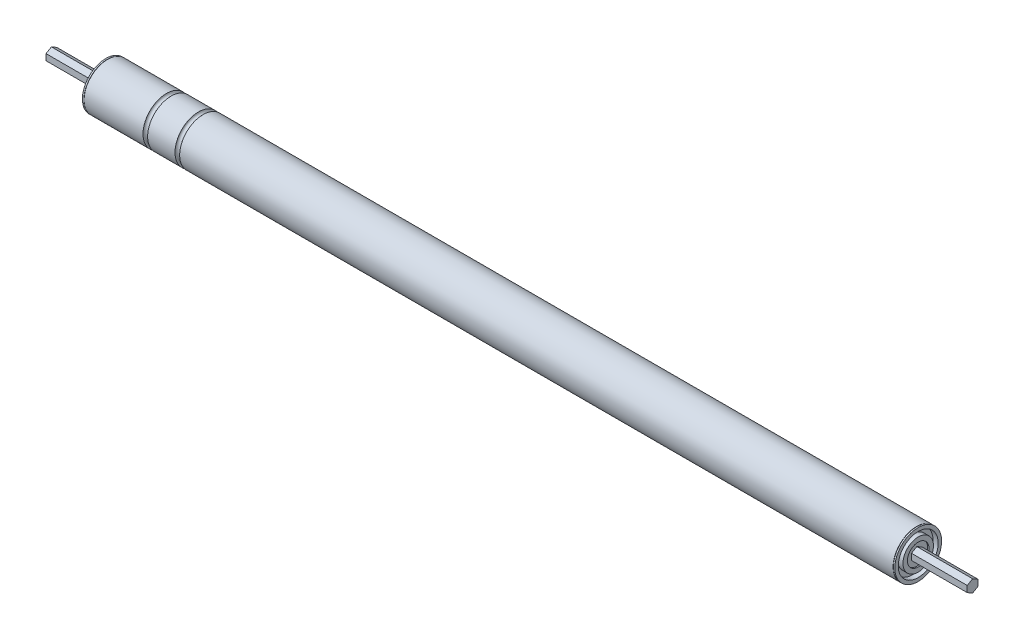
ISO-10303-21;
HEADER;
FILE_DESCRIPTION(('STEP AP214'),'2;1');
FILE_NAME('part.step','',(''),(''),'','','');
FILE_SCHEMA(('AUTOMOTIVE_DESIGN { 1 0 10303 214 1 1 1 1 }'));
ENDSEC;
DATA;
#1=APPLICATION_CONTEXT('core data for automotive mechanical design processes');
#2=APPLICATION_PROTOCOL_DEFINITION('international standard','automotive_design',2000,#1);
#3=PRODUCT_CONTEXT('',#1,'mechanical');
#4=PRODUCT('Part','Part','',(#3));
#5=PRODUCT_RELATED_PRODUCT_CATEGORY('part','',(#4));
#6=PRODUCT_DEFINITION_FORMATION('','',#4);
#7=PRODUCT_DEFINITION_CONTEXT('part definition',#1,'design');
#8=PRODUCT_DEFINITION('design','',#6,#7);
#9=PRODUCT_DEFINITION_SHAPE('','',#8);
#10=(LENGTH_UNIT() NAMED_UNIT(*) SI_UNIT(.MILLI.,.METRE.));
#11=(NAMED_UNIT(*) PLANE_ANGLE_UNIT() SI_UNIT($,.RADIAN.));
#12=(NAMED_UNIT(*) SI_UNIT($,.STERADIAN.) SOLID_ANGLE_UNIT());
#13=UNCERTAINTY_MEASURE_WITH_UNIT(LENGTH_MEASURE(1.E-05),#10,'distance_accuracy_value','');
#14=(GEOMETRIC_REPRESENTATION_CONTEXT(3) GLOBAL_UNCERTAINTY_ASSIGNED_CONTEXT((#13)) GLOBAL_UNIT_ASSIGNED_CONTEXT((#10,
#11,#12)) REPRESENTATION_CONTEXT('',''));
#15=CARTESIAN_POINT('',(0.,0.,0.));
#16=DIRECTION('',(0.,0.,1.));
#17=DIRECTION('',(1.,0.,0.));
#18=AXIS2_PLACEMENT_3D('',#15,#16,#17);
#19=CARTESIAN_POINT('',(480.034821520126,0.,0.));
#20=DIRECTION('',(-1.,0.,0.));
#21=DIRECTION('',(0.,0.,1.));
#22=AXIS2_PLACEMENT_3D('',#19,#20,#21);
#23=CYLINDRICAL_SURFACE('',#22,24.13);
#24=CARTESIAN_POINT('',(-351.630678291306,0.,0.));
#25=DIRECTION('',(1.,0.,0.));
#26=DIRECTION('',(0.,1.,0.));
#27=AXIS2_PLACEMENT_3D('',#24,#25,#26);
#28=CIRCLE('',#27,24.13);
#29=CARTESIAN_POINT('',(-351.630678291306,24.1300000000001,0.));
#30=VERTEX_POINT('',#29);
#31=EDGE_CURVE('E359',#30,#30,#28,.F.);
#32=ORIENTED_EDGE('',*,*,#31,.F.);
#33=EDGE_LOOP('',(#32));
#34=FACE_BOUND('',#33,.T.);
#35=CARTESIAN_POINT('',(-323.374321708694,0.,0.));
#36=DIRECTION('',(-1.,0.,0.));
#37=DIRECTION('',(0.,-1.,0.));
#38=AXIS2_PLACEMENT_3D('',#35,#36,#37);
#39=CIRCLE('',#38,24.13);
#40=CARTESIAN_POINT('',(-323.374321708694,-24.1299999999999,0.));
#41=VERTEX_POINT('',#40);
#42=EDGE_CURVE('E203',#41,#41,#39,.F.);
#43=ORIENTED_EDGE('',*,*,#42,.F.);
#44=EDGE_LOOP('',(#43));
#45=FACE_BOUND('',#44,.T.);
#46=ADVANCED_FACE('F39',(#34,#45),#23,.T.);
#47=CARTESIAN_POINT('',(-350.84385,0.,0.));
#48=DIRECTION('',(-1.,0.,0.));
#49=DIRECTION('',(0.,-1.,0.));
#50=AXIS2_PLACEMENT_3D('',#47,#48,#49);
#51=TOROIDAL_SURFACE('',#50,24.1000000000011,0.787399999999969);
#52=CARTESIAN_POINT('',(-351.63125,0.,0.));
#53=DIRECTION('',(-1.,0.,0.));
#54=DIRECTION('',(0.,-1.,0.));
#55=AXIS2_PLACEMENT_3D('',#52,#53,#54);
#56=CIRCLE('',#55,24.1000000000012);
#57=CARTESIAN_POINT('',(-351.63125,-24.1000000000011,0.));
#58=VERTEX_POINT('',#57);
#59=EDGE_CURVE('E208',#58,#58,#56,.T.);
#60=ORIENTED_EDGE('',*,*,#59,.F.);
#61=EDGE_LOOP('',(#60));
#62=FACE_BOUND('',#61,.T.);
#63=ORIENTED_EDGE('',*,*,#31,.T.);
#64=EDGE_LOOP('',(#63));
#65=FACE_BOUND('',#64,.T.);
#66=ADVANCED_FACE('F390',(#62,#65),#51,.T.);
#67=CARTESIAN_POINT('',(-357.18115,0.,0.));
#68=DIRECTION('',(-1.,0.,0.));
#69=DIRECTION('',(0.,-1.,0.));
#70=AXIS2_PLACEMENT_3D('',#67,#68,#69);
#71=TOROIDAL_SURFACE('',#70,24.1000000000012,0.787399999999969);
#72=CARTESIAN_POINT('',(-356.39375,0.,0.));
#73=DIRECTION('',(-1.,0.,0.));
#74=DIRECTION('',(0.,-1.,0.));
#75=AXIS2_PLACEMENT_3D('',#72,#73,#74);
#76=CIRCLE('',#75,24.1000000000012);
#77=CARTESIAN_POINT('',(-356.39375,-24.1000000000011,0.));
#78=VERTEX_POINT('',#77);
#79=EDGE_CURVE('E204',#78,#78,#76,.T.);
#80=ORIENTED_EDGE('',*,*,#79,.T.);
#81=EDGE_LOOP('',(#80));
#82=FACE_BOUND('',#81,.T.);
#83=CARTESIAN_POINT('',(-356.394321708694,0.,0.));
#84=DIRECTION('',(-1.,0.,0.));
#85=DIRECTION('',(0.,-1.,0.));
#86=AXIS2_PLACEMENT_3D('',#83,#84,#85);
#87=CIRCLE('',#86,24.13);
#88=CARTESIAN_POINT('',(-356.394321708694,-24.1299999999999,0.));
#89=VERTEX_POINT('',#88);
#90=EDGE_CURVE('E212',#89,#89,#87,.F.);
#91=ORIENTED_EDGE('',*,*,#90,.T.);
#92=EDGE_LOOP('',(#91));
#93=FACE_BOUND('',#92,.T.);
#94=ADVANCED_FACE('F409',(#82,#93),#71,.T.);
#95=CARTESIAN_POINT('',(-354.0125,0.,0.));
#96=DIRECTION('',(-1.,0.,0.));
#97=DIRECTION('',(0.,-1.,0.));
#98=AXIS2_PLACEMENT_3D('',#95,#96,#97);
#99=TOROIDAL_SURFACE('',#98,24.1000000000012,2.38125000000006);
#100=ORIENTED_EDGE('',*,*,#59,.T.);
#101=EDGE_LOOP('',(#100));
#102=FACE_BOUND('',#101,.T.);
#103=ORIENTED_EDGE('',*,*,#79,.F.);
#104=EDGE_LOOP('',(#103));
#105=FACE_BOUND('',#104,.T.);
#106=ADVANCED_FACE('F411',(#102,#105),#99,.F.);
#107=CARTESIAN_POINT('',(431.8,-3.20790243318486,-5.55625));
#108=DIRECTION('',(0.,0.,1.));
#109=DIRECTION('',(1.,0.,0.));
#110=AXIS2_PLACEMENT_3D('',#107,#108,#109);
#111=PLANE('',#110);
#112=DIRECTION('',(-1.,0.,0.));
#113=VECTOR('',#112,1.);
#114=CARTESIAN_POINT('',(431.8,3.20790243318486,-5.55625));
#115=LINE('',#114,#113);
#116=CARTESIAN_POINT('',(-417.5125,3.20790243318486,-5.55625));
#117=VERTEX_POINT('',#116);
#118=CARTESIAN_POINT('',(-475.,3.20790243318486,-5.55625));
#119=VERTEX_POINT('',#118);
#120=EDGE_CURVE('E154',#117,#119,#115,.T.);
#121=ORIENTED_EDGE('',*,*,#120,.F.);
#122=DIRECTION('',(0.,-1.,0.));
#123=VECTOR('',#122,1.);
#124=CARTESIAN_POINT('',(-417.5125,0.,-5.55625));
#125=LINE('',#124,#123);
#126=CARTESIAN_POINT('',(-417.5125,-3.20790243318486,-5.55625));
#127=VERTEX_POINT('',#126);
#128=EDGE_CURVE('E238',#117,#127,#125,.T.);
#129=ORIENTED_EDGE('',*,*,#128,.T.);
#130=DIRECTION('',(-1.,0.,0.));
#131=VECTOR('',#130,1.);
#132=CARTESIAN_POINT('',(431.8,-3.20790243318486,-5.55625));
#133=LINE('',#132,#131);
#134=CARTESIAN_POINT('',(-475.,-3.20790243318486,-5.55625));
#135=VERTEX_POINT('',#134);
#136=EDGE_CURVE('E217',#127,#135,#133,.T.);
#137=ORIENTED_EDGE('',*,*,#136,.T.);
#138=DIRECTION('',(0.,1.,0.));
#139=VECTOR('',#138,1.);
#140=CARTESIAN_POINT('',(-475.,-3.20790243318486,-5.55625));
#141=LINE('',#140,#139);
#142=EDGE_CURVE('E168',#135,#119,#141,.T.);
#143=ORIENTED_EDGE('',*,*,#142,.T.);
#144=EDGE_LOOP('',(#121,#129,#137,#143));
#145=FACE_BOUND('',#144,.T.);
#146=ADVANCED_FACE('F418',(#145),#111,.F.);
#147=CARTESIAN_POINT('',(431.8,-6.41580486636972,0.));
#148=DIRECTION('',(0.,0.866025403784439,0.5));
#149=DIRECTION('',(0.,-0.5,0.866025403784439));
#150=AXIS2_PLACEMENT_3D('',#147,#148,#149);
#151=PLANE('',#150);
#152=ORIENTED_EDGE('',*,*,#136,.F.);
#153=DIRECTION('',(0.,-0.5,0.866025403784439));
#154=VECTOR('',#153,1.);
#155=CARTESIAN_POINT('',(-417.5125,-4.81185364977729,-2.778125));
#156=LINE('',#155,#154);
#157=CARTESIAN_POINT('',(-417.5125,-6.41580486636971,0.));
#158=VERTEX_POINT('',#157);
#159=EDGE_CURVE('E242',#127,#158,#156,.T.);
#160=ORIENTED_EDGE('',*,*,#159,.T.);
#161=DIRECTION('',(-1.,0.,0.));
#162=VECTOR('',#161,1.);
#163=CARTESIAN_POINT('',(431.8,-6.41580486636972,0.));
#164=LINE('',#163,#162);
#165=CARTESIAN_POINT('',(-475.,-6.41580486636972,0.));
#166=VERTEX_POINT('',#165);
#167=EDGE_CURVE('E222',#158,#166,#164,.T.);
#168=ORIENTED_EDGE('',*,*,#167,.T.);
#169=DIRECTION('',(0.,0.5,-0.866025403784439));
#170=VECTOR('',#169,1.);
#171=CARTESIAN_POINT('',(-475.,-6.41580486636972,0.));
#172=LINE('',#171,#170);
#173=EDGE_CURVE('E164',#166,#135,#172,.T.);
#174=ORIENTED_EDGE('',*,*,#173,.T.);
#175=EDGE_LOOP('',(#152,#160,#168,#174));
#176=FACE_BOUND('',#175,.T.);
#177=ADVANCED_FACE('F427',(#176),#151,.F.);
#178=CARTESIAN_POINT('',(431.8,-3.20790243318486,5.55625));
#179=DIRECTION('',(0.,0.866025403784439,-0.5));
#180=DIRECTION('',(0.,0.5,0.866025403784439));
#181=AXIS2_PLACEMENT_3D('',#178,#179,#180);
#182=PLANE('',#181);
#183=ORIENTED_EDGE('',*,*,#167,.F.);
#184=DIRECTION('',(0.,0.5,0.866025403784439));
#185=VECTOR('',#184,1.);
#186=CARTESIAN_POINT('',(-417.5125,-4.81185364977729,2.778125));
#187=LINE('',#186,#185);
#188=CARTESIAN_POINT('',(-417.5125,-3.20790243318486,5.55625));
#189=VERTEX_POINT('',#188);
#190=EDGE_CURVE('E246',#158,#189,#187,.T.);
#191=ORIENTED_EDGE('',*,*,#190,.T.);
#192=DIRECTION('',(-1.,0.,0.));
#193=VECTOR('',#192,1.);
#194=CARTESIAN_POINT('',(431.8,-3.20790243318486,5.55625));
#195=LINE('',#194,#193);
#196=CARTESIAN_POINT('',(-475.,-3.20790243318486,5.55625));
#197=VERTEX_POINT('',#196);
#198=EDGE_CURVE('E227',#189,#197,#195,.T.);
#199=ORIENTED_EDGE('',*,*,#198,.T.);
#200=DIRECTION('',(0.,-0.5,-0.866025403784439));
#201=VECTOR('',#200,1.);
#202=CARTESIAN_POINT('',(-475.,-3.20790243318486,5.55625));
#203=LINE('',#202,#201);
#204=EDGE_CURVE('E160',#197,#166,#203,.T.);
#205=ORIENTED_EDGE('',*,*,#204,.T.);
#206=EDGE_LOOP('',(#183,#191,#199,#205));
#207=FACE_BOUND('',#206,.T.);
#208=ADVANCED_FACE('F432',(#207),#182,.F.);
#209=CARTESIAN_POINT('',(431.8,3.20790243318486,5.55625));
#210=DIRECTION('',(0.,0.,-1.));
#211=DIRECTION('',(-1.,0.,0.));
#212=AXIS2_PLACEMENT_3D('',#209,#210,#211);
#213=PLANE('',#212);
#214=ORIENTED_EDGE('',*,*,#198,.F.);
#215=DIRECTION('',(0.,1.,0.));
#216=VECTOR('',#215,1.);
#217=CARTESIAN_POINT('',(-417.5125,0.,5.55625));
#218=LINE('',#217,#216);
#219=CARTESIAN_POINT('',(-417.5125,3.20790243318486,5.55625));
#220=VERTEX_POINT('',#219);
#221=EDGE_CURVE('E250',#189,#220,#218,.T.);
#222=ORIENTED_EDGE('',*,*,#221,.T.);
#223=DIRECTION('',(-1.,0.,0.));
#224=VECTOR('',#223,1.);
#225=CARTESIAN_POINT('',(431.8,3.20790243318486,5.55625));
#226=LINE('',#225,#224);
#227=CARTESIAN_POINT('',(-475.,3.20790243318486,5.55625));
#228=VERTEX_POINT('',#227);
#229=EDGE_CURVE('E232',#220,#228,#226,.T.);
#230=ORIENTED_EDGE('',*,*,#229,.T.);
#231=DIRECTION('',(0.,-1.,0.));
#232=VECTOR('',#231,1.);
#233=CARTESIAN_POINT('',(-475.,3.20790243318486,5.55625));
#234=LINE('',#233,#232);
#235=EDGE_CURVE('E149',#228,#197,#234,.T.);
#236=ORIENTED_EDGE('',*,*,#235,.T.);
#237=EDGE_LOOP('',(#214,#222,#230,#236));
#238=FACE_BOUND('',#237,.T.);
#239=ADVANCED_FACE('F437',(#238),#213,.F.);
#240=CARTESIAN_POINT('',(431.8,6.41580486636972,0.));
#241=DIRECTION('',(0.,-0.866025403784439,-0.5));
#242=DIRECTION('',(0.,0.5,-0.866025403784439));
#243=AXIS2_PLACEMENT_3D('',#240,#241,#242);
#244=PLANE('',#243);
#245=ORIENTED_EDGE('',*,*,#229,.F.);
#246=DIRECTION('',(0.,0.5,-0.866025403784439));
#247=VECTOR('',#246,1.);
#248=CARTESIAN_POINT('',(-417.5125,4.81185364977729,2.778125));
#249=LINE('',#248,#247);
#250=CARTESIAN_POINT('',(-417.5125,6.41580486636972,0.));
#251=VERTEX_POINT('',#250);
#252=EDGE_CURVE('E61',#220,#251,#249,.T.);
#253=ORIENTED_EDGE('',*,*,#252,.T.);
#254=DIRECTION('',(-1.,0.,0.));
#255=VECTOR('',#254,1.);
#256=CARTESIAN_POINT('',(431.8,6.41580486636972,0.));
#257=LINE('',#256,#255);
#258=CARTESIAN_POINT('',(-475.,6.41580486636972,0.));
#259=VERTEX_POINT('',#258);
#260=EDGE_CURVE('E129',#251,#259,#257,.T.);
#261=ORIENTED_EDGE('',*,*,#260,.T.);
#262=DIRECTION('',(0.,-0.5,0.866025403784439));
#263=VECTOR('',#262,1.);
#264=CARTESIAN_POINT('',(-475.,6.41580486636972,0.));
#265=LINE('',#264,#263);
#266=EDGE_CURVE('E133',#259,#228,#265,.T.);
#267=ORIENTED_EDGE('',*,*,#266,.T.);
#268=EDGE_LOOP('',(#245,#253,#261,#267));
#269=FACE_BOUND('',#268,.T.);
#270=ADVANCED_FACE('F132',(#269),#244,.F.);
#271=CARTESIAN_POINT('',(431.8,3.20790243318486,-5.55625));
#272=DIRECTION('',(0.,-0.866025403784439,0.5));
#273=DIRECTION('',(0.,-0.5,-0.866025403784439));
#274=AXIS2_PLACEMENT_3D('',#271,#272,#273);
#275=PLANE('',#274);
#276=ORIENTED_EDGE('',*,*,#260,.F.);
#277=DIRECTION('',(0.,-0.5,-0.866025403784439));
#278=VECTOR('',#277,1.);
#279=CARTESIAN_POINT('',(-417.5125,4.81185364977729,-2.778125));
#280=LINE('',#279,#278);
#281=EDGE_CURVE('E57',#251,#117,#280,.T.);
#282=ORIENTED_EDGE('',*,*,#281,.T.);
#283=ORIENTED_EDGE('',*,*,#120,.T.);
#284=DIRECTION('',(0.,0.5,0.866025403784439));
#285=VECTOR('',#284,1.);
#286=CARTESIAN_POINT('',(-475.,3.20790243318486,-5.55625));
#287=LINE('',#286,#285);
#288=EDGE_CURVE('E145',#119,#259,#287,.T.);
#289=ORIENTED_EDGE('',*,*,#288,.T.);
#290=EDGE_LOOP('',(#276,#282,#283,#289));
#291=FACE_BOUND('',#290,.T.);
#292=ADVANCED_FACE('F152',(#291),#275,.F.);
#293=CARTESIAN_POINT('',(-417.5125,0.,0.));
#294=DIRECTION('',(1.,0.,0.));
#295=DIRECTION('',(0.,1.,0.));
#296=AXIS2_PLACEMENT_3D('',#293,#294,#295);
#297=PLANE('',#296);
#298=CARTESIAN_POINT('',(-417.5125,0.,0.));
#299=DIRECTION('',(-1.,0.,0.));
#300=DIRECTION('',(0.,-1.,0.));
#301=AXIS2_PLACEMENT_3D('',#298,#299,#300);
#302=CIRCLE('',#301,11.1125);
#303=CARTESIAN_POINT('',(-417.5125,-11.1125,0.));
#304=VERTEX_POINT('',#303);
#305=EDGE_CURVE('E317',#304,#304,#302,.T.);
#306=ORIENTED_EDGE('',*,*,#305,.T.);
#307=EDGE_LOOP('',(#306));
#308=FACE_BOUND('',#307,.T.);
#309=ORIENTED_EDGE('',*,*,#281,.F.);
#310=ORIENTED_EDGE('',*,*,#252,.F.);
#311=ORIENTED_EDGE('',*,*,#221,.F.);
#312=ORIENTED_EDGE('',*,*,#190,.F.);
#313=ORIENTED_EDGE('',*,*,#159,.F.);
#314=ORIENTED_EDGE('',*,*,#128,.F.);
#315=EDGE_LOOP('',(#309,#310,#311,#312,#313,#314));
#316=FACE_BOUND('',#315,.T.);
#317=ADVANCED_FACE('F448',(#308,#316),#297,.F.);
#318=CARTESIAN_POINT('',(-417.5125,0.,0.));
#319=DIRECTION('',(-1.,0.,0.));
#320=DIRECTION('',(0.,-1.,0.));
#321=AXIS2_PLACEMENT_3D('',#318,#319,#320);
#322=CYLINDRICAL_SURFACE('',#321,11.1125);
#323=ORIENTED_EDGE('',*,*,#305,.F.);
#324=EDGE_LOOP('',(#323));
#325=FACE_BOUND('',#324,.T.);
#326=CARTESIAN_POINT('',(-418.896875,0.,0.));
#327=DIRECTION('',(-1.,0.,0.));
#328=DIRECTION('',(0.,-1.,0.));
#329=AXIS2_PLACEMENT_3D('',#326,#327,#328);
#330=CIRCLE('',#329,11.1125);
#331=CARTESIAN_POINT('',(-418.896875,-11.1125,0.));
#332=VERTEX_POINT('',#331);
#333=EDGE_CURVE('E313',#332,#332,#330,.T.);
#334=ORIENTED_EDGE('',*,*,#333,.T.);
#335=EDGE_LOOP('',(#334));
#336=FACE_BOUND('',#335,.T.);
#337=ADVANCED_FACE('F573',(#325,#336),#322,.F.);
#338=CARTESIAN_POINT('',(-418.896875,-11.1125,0.));
#339=DIRECTION('',(1.,0.,0.));
#340=DIRECTION('',(0.,1.,0.));
#341=AXIS2_PLACEMENT_3D('',#338,#339,#340);
#342=PLANE('',#341);
#343=ORIENTED_EDGE('',*,*,#333,.F.);
#344=EDGE_LOOP('',(#343));
#345=FACE_BOUND('',#344,.T.);
#346=CARTESIAN_POINT('',(-418.896875,0.,0.));
#347=DIRECTION('',(-1.,0.,0.));
#348=DIRECTION('',(0.,-1.,0.));
#349=AXIS2_PLACEMENT_3D('',#346,#347,#348);
#350=CIRCLE('',#349,15.7129275651736);
#351=CARTESIAN_POINT('',(-418.896875,-15.7129275651736,0.));
#352=VERTEX_POINT('',#351);
#353=EDGE_CURVE('E309',#352,#352,#350,.T.);
#354=ORIENTED_EDGE('',*,*,#353,.T.);
#355=EDGE_LOOP('',(#354));
#356=FACE_BOUND('',#355,.T.);
#357=ADVANCED_FACE('F582',(#345,#356),#342,.F.);
#358=CARTESIAN_POINT('',(-417.5125,0.,0.));
#359=DIRECTION('',(-1.,0.,0.));
#360=DIRECTION('',(0.,-1.,0.));
#361=AXIS2_PLACEMENT_3D('',#358,#359,#360);
#362=CYLINDRICAL_SURFACE('',#361,15.7129275651736);
#363=ORIENTED_EDGE('',*,*,#353,.F.);
#364=EDGE_LOOP('',(#363));
#365=FACE_BOUND('',#364,.T.);
#366=CARTESIAN_POINT('',(-413.562875,0.,0.));
#367=DIRECTION('',(-1.,0.,0.));
#368=DIRECTION('',(0.,-1.,0.));
#369=AXIS2_PLACEMENT_3D('',#366,#367,#368);
#370=CIRCLE('',#369,15.7129275651736);
#371=CARTESIAN_POINT('',(-413.562875,-15.7129275651736,0.));
#372=VERTEX_POINT('',#371);
#373=EDGE_CURVE('E305',#372,#372,#370,.T.);
#374=ORIENTED_EDGE('',*,*,#373,.T.);
#375=EDGE_LOOP('',(#374));
#376=FACE_BOUND('',#375,.T.);
#377=ADVANCED_FACE('F590',(#365,#376),#362,.T.);
#378=CARTESIAN_POINT('',(-413.562875,-15.7129275651736,1.09722786744795E-13));
#379=DIRECTION('',(1.,0.,0.));
#380=DIRECTION('',(0.,1.,0.));
#381=AXIS2_PLACEMENT_3D('',#378,#379,#380);
#382=PLANE('',#381);
#383=ORIENTED_EDGE('',*,*,#373,.F.);
#384=EDGE_LOOP('',(#383));
#385=FACE_BOUND('',#384,.T.);
#386=CARTESIAN_POINT('',(-413.562875,0.,0.));
#387=DIRECTION('',(-1.,0.,0.));
#388=DIRECTION('',(0.,-1.,0.));
#389=AXIS2_PLACEMENT_3D('',#386,#387,#388);
#390=CIRCLE('',#389,20.574);
#391=CARTESIAN_POINT('',(-413.562875,-20.574,0.));
#392=VERTEX_POINT('',#391);
#393=EDGE_CURVE('E301',#392,#392,#390,.T.);
#394=ORIENTED_EDGE('',*,*,#393,.T.);
#395=EDGE_LOOP('',(#394));
#396=FACE_BOUND('',#395,.T.);
#397=ADVANCED_FACE('F598',(#385,#396),#382,.F.);
#398=CARTESIAN_POINT('',(-417.5125,0.,0.));
#399=DIRECTION('',(-1.,0.,0.));
#400=DIRECTION('',(0.,-1.,0.));
#401=AXIS2_PLACEMENT_3D('',#398,#399,#400);
#402=CYLINDRICAL_SURFACE('',#401,20.574);
#403=ORIENTED_EDGE('',*,*,#393,.F.);
#404=EDGE_LOOP('',(#403));
#405=FACE_BOUND('',#404,.T.);
#406=CARTESIAN_POINT('',(-418.896875,0.,0.));
#407=DIRECTION('',(-1.,0.,0.));
#408=DIRECTION('',(0.,-1.,0.));
#409=AXIS2_PLACEMENT_3D('',#406,#407,#408);
#410=CIRCLE('',#409,20.574);
#411=CARTESIAN_POINT('',(-418.896875,-20.574,0.));
#412=VERTEX_POINT('',#411);
#413=EDGE_CURVE('E297',#412,#412,#410,.T.);
#414=ORIENTED_EDGE('',*,*,#413,.T.);
#415=EDGE_LOOP('',(#414));
#416=FACE_BOUND('',#415,.T.);
#417=ADVANCED_FACE('F606',(#405,#416),#402,.F.);
#418=CARTESIAN_POINT('',(-418.896875,-24.13,1.6849888941257E-13));
#419=DIRECTION('',(1.,0.,0.));
#420=DIRECTION('',(0.,1.,0.));
#421=AXIS2_PLACEMENT_3D('',#418,#419,#420);
#422=PLANE('',#421);
#423=ORIENTED_EDGE('',*,*,#413,.F.);
#424=EDGE_LOOP('',(#423));
#425=FACE_BOUND('',#424,.T.);
#426=CARTESIAN_POINT('',(-418.896875,0.,0.));
#427=DIRECTION('',(-1.,0.,0.));
#428=DIRECTION('',(0.,-1.,0.));
#429=AXIS2_PLACEMENT_3D('',#426,#427,#428);
#430=CIRCLE('',#429,24.13);
#431=CARTESIAN_POINT('',(-418.896875,-24.13,0.));
#432=VERTEX_POINT('',#431);
#433=EDGE_CURVE('E293',#432,#432,#430,.T.);
#434=ORIENTED_EDGE('',*,*,#433,.T.);
#435=EDGE_LOOP('',(#434));
#436=FACE_BOUND('',#435,.T.);
#437=ADVANCED_FACE('F614',(#425,#436),#422,.F.);
#438=CARTESIAN_POINT('',(-417.5125,0.,0.));
#439=DIRECTION('',(-1.,0.,0.));
#440=DIRECTION('',(0.,-1.,0.));
#441=AXIS2_PLACEMENT_3D('',#438,#439,#440);
#442=CYLINDRICAL_SURFACE('',#441,24.13);
#443=CARTESIAN_POINT('',(-417.372875,0.,0.));
#444=DIRECTION('',(-1.,0.,0.));
#445=DIRECTION('',(0.,-1.,0.));
#446=AXIS2_PLACEMENT_3D('',#443,#444,#445);
#447=CIRCLE('',#446,24.13);
#448=CARTESIAN_POINT('',(-417.372875,-24.13,0.));
#449=VERTEX_POINT('',#448);
#450=EDGE_CURVE('E321',#449,#449,#447,.T.);
#451=ORIENTED_EDGE('',*,*,#450,.T.);
#452=EDGE_LOOP('',(#451));
#453=FACE_BOUND('',#452,.T.);
#454=ORIENTED_EDGE('',*,*,#433,.F.);
#455=EDGE_LOOP('',(#454));
#456=FACE_BOUND('',#455,.T.);
#457=ADVANCED_FACE('F622',(#453,#456),#442,.T.);
#458=CARTESIAN_POINT('',(-417.372875,0.,0.));
#459=DIRECTION('',(-1.,0.,0.));
#460=DIRECTION('',(0.,-1.,0.));
#461=AXIS2_PLACEMENT_3D('',#458,#459,#460);
#462=CONICAL_SURFACE('',#461,24.13,0.785398163397469);
#463=CARTESIAN_POINT('',(-417.118875,0.,0.));
#464=DIRECTION('',(-1.,0.,0.));
#465=DIRECTION('',(0.,-1.,0.));
#466=AXIS2_PLACEMENT_3D('',#463,#464,#465);
#467=CIRCLE('',#466,23.876);
#468=CARTESIAN_POINT('',(-417.118875,-23.876,0.));
#469=VERTEX_POINT('',#468);
#470=EDGE_CURVE('E325',#469,#469,#467,.F.);
#471=ORIENTED_EDGE('',*,*,#470,.F.);
#472=EDGE_LOOP('',(#471));
#473=FACE_BOUND('',#472,.T.);
#474=ORIENTED_EDGE('',*,*,#450,.F.);
#475=EDGE_LOOP('',(#474));
#476=FACE_BOUND('',#475,.T.);
#477=ADVANCED_FACE('F402',(#473,#476),#462,.T.);
#478=CARTESIAN_POINT('',(-417.118875,-24.13,1.6849888941257E-13));
#479=DIRECTION('',(-1.,0.,0.));
#480=DIRECTION('',(0.,-1.,0.));
#481=AXIS2_PLACEMENT_3D('',#478,#479,#480);
#482=PLANE('',#481);
#483=ORIENTED_EDGE('',*,*,#470,.T.);
#484=EDGE_LOOP('',(#483));
#485=FACE_BOUND('',#484,.T.);
#486=CARTESIAN_POINT('',(-417.118875,0.,0.));
#487=DIRECTION('',(-1.,0.,0.));
#488=DIRECTION('',(0.,-1.,0.));
#489=AXIS2_PLACEMENT_3D('',#486,#487,#488);
#490=CIRCLE('',#489,24.13);
#491=CARTESIAN_POINT('',(-417.118875,-24.13,0.));
#492=VERTEX_POINT('',#491);
#493=EDGE_CURVE('E261',#492,#492,#490,.T.);
#494=ORIENTED_EDGE('',*,*,#493,.T.);
#495=EDGE_LOOP('',(#494));
#496=FACE_BOUND('',#495,.T.);
#497=ADVANCED_FACE('F393',(#485,#496),#482,.T.);
#498=ORIENTED_EDGE('',*,*,#493,.F.);
#499=EDGE_LOOP('',(#498));
#500=FACE_BOUND('',#499,.T.);
#501=ORIENTED_EDGE('',*,*,#90,.F.);
#502=EDGE_LOOP('',(#501));
#503=FACE_BOUND('',#502,.T.);
#504=ADVANCED_FACE('F378',(#500,#503),#23,.T.);
#505=CARTESIAN_POINT('',(-317.82385,0.,0.));
#506=DIRECTION('',(-1.,0.,0.));
#507=DIRECTION('',(0.,-1.,0.));
#508=AXIS2_PLACEMENT_3D('',#505,#506,#507);
#509=TOROIDAL_SURFACE('',#508,24.1000000000011,0.787399999999969);
#510=CARTESIAN_POINT('',(-318.61125,0.,0.));
#511=DIRECTION('',(-1.,0.,0.));
#512=DIRECTION('',(0.,-1.,0.));
#513=AXIS2_PLACEMENT_3D('',#510,#511,#512);
#514=CIRCLE('',#513,24.1000000000012);
#515=CARTESIAN_POINT('',(-318.61125,-24.1000000000011,0.));
#516=VERTEX_POINT('',#515);
#517=EDGE_CURVE('E199',#516,#516,#514,.T.);
#518=ORIENTED_EDGE('',*,*,#517,.F.);
#519=EDGE_LOOP('',(#518));
#520=FACE_BOUND('',#519,.T.);
#521=CARTESIAN_POINT('',(-318.610678291306,0.,0.));
#522=DIRECTION('',(1.,0.,0.));
#523=DIRECTION('',(0.,1.,0.));
#524=AXIS2_PLACEMENT_3D('',#521,#522,#523);
#525=CIRCLE('',#524,24.13);
#526=CARTESIAN_POINT('',(-318.610678291306,24.1300000000001,0.));
#527=VERTEX_POINT('',#526);
#528=EDGE_CURVE('E43',#527,#527,#525,.F.);
#529=ORIENTED_EDGE('',*,*,#528,.T.);
#530=EDGE_LOOP('',(#529));
#531=FACE_BOUND('',#530,.T.);
#532=ADVANCED_FACE('F370',(#520,#531),#509,.T.);
#533=CARTESIAN_POINT('',(-324.16115,0.,0.));
#534=DIRECTION('',(-1.,0.,0.));
#535=DIRECTION('',(0.,-1.,0.));
#536=AXIS2_PLACEMENT_3D('',#533,#534,#535);
#537=TOROIDAL_SURFACE('',#536,24.1000000000012,0.787399999999969);
#538=CARTESIAN_POINT('',(-323.37375,0.,0.));
#539=DIRECTION('',(-1.,0.,0.));
#540=DIRECTION('',(0.,-1.,0.));
#541=AXIS2_PLACEMENT_3D('',#538,#539,#540);
#542=CIRCLE('',#541,24.1000000000012);
#543=CARTESIAN_POINT('',(-323.37375,-24.1000000000011,0.));
#544=VERTEX_POINT('',#543);
#545=EDGE_CURVE('E195',#544,#544,#542,.T.);
#546=ORIENTED_EDGE('',*,*,#545,.T.);
#547=EDGE_LOOP('',(#546));
#548=FACE_BOUND('',#547,.T.);
#549=ORIENTED_EDGE('',*,*,#42,.T.);
#550=EDGE_LOOP('',(#549));
#551=FACE_BOUND('',#550,.T.);
#552=ADVANCED_FACE('F399',(#548,#551),#537,.T.);
#553=CARTESIAN_POINT('',(-320.9925,0.,0.));
#554=DIRECTION('',(-1.,0.,0.));
#555=DIRECTION('',(0.,-1.,0.));
#556=AXIS2_PLACEMENT_3D('',#553,#554,#555);
#557=TOROIDAL_SURFACE('',#556,24.1000000000012,2.38125000000006);
#558=ORIENTED_EDGE('',*,*,#517,.T.);
#559=EDGE_LOOP('',(#558));
#560=FACE_BOUND('',#559,.T.);
#561=ORIENTED_EDGE('',*,*,#545,.F.);
#562=EDGE_LOOP('',(#561));
#563=FACE_BOUND('',#562,.T.);
#564=ADVANCED_FACE('F499',(#560,#563),#557,.F.);
#565=CARTESIAN_POINT('',(475.,6.41580486636972,0.));
#566=VERTEX_POINT('',#565);
#567=CARTESIAN_POINT('',(417.5125,6.41580486636972,0.));
#568=VERTEX_POINT('',#567);
#569=EDGE_CURVE('E137',#566,#568,#257,.T.);
#570=ORIENTED_EDGE('',*,*,#569,.T.);
#571=DIRECTION('',(0.,-0.5,0.866025403784439));
#572=VECTOR('',#571,1.);
#573=CARTESIAN_POINT('',(417.5125,4.81185364977729,2.778125));
#574=LINE('',#573,#572);
#575=CARTESIAN_POINT('',(417.5125,3.20790243318486,5.55625));
#576=VERTEX_POINT('',#575);
#577=EDGE_CURVE('E49',#568,#576,#574,.T.);
#578=ORIENTED_EDGE('',*,*,#577,.T.);
#579=CARTESIAN_POINT('',(475.,3.20790243318486,5.55625));
#580=VERTEX_POINT('',#579);
#581=EDGE_CURVE('E138',#580,#576,#226,.T.);
#582=ORIENTED_EDGE('',*,*,#581,.F.);
#583=DIRECTION('',(0.,-0.5,0.866025403784439));
#584=VECTOR('',#583,1.);
#585=CARTESIAN_POINT('',(475.,6.41580486636972,0.));
#586=LINE('',#585,#584);
#587=EDGE_CURVE('E175',#566,#580,#586,.T.);
#588=ORIENTED_EDGE('',*,*,#587,.F.);
#589=EDGE_LOOP('',(#570,#578,#582,#588));
#590=FACE_BOUND('',#589,.T.);
#591=ADVANCED_FACE('F446',(#590),#244,.F.);
#592=ORIENTED_EDGE('',*,*,#581,.T.);
#593=DIRECTION('',(0.,-1.,0.));
#594=VECTOR('',#593,1.);
#595=CARTESIAN_POINT('',(417.5125,0.,5.55625));
#596=LINE('',#595,#594);
#597=CARTESIAN_POINT('',(417.5125,-3.20790243318486,5.55625));
#598=VERTEX_POINT('',#597);
#599=EDGE_CURVE('E349',#576,#598,#596,.T.);
#600=ORIENTED_EDGE('',*,*,#599,.T.);
#601=CARTESIAN_POINT('',(475.,-3.20790243318486,5.55625));
#602=VERTEX_POINT('',#601);
#603=EDGE_CURVE('E228',#602,#598,#195,.T.);
#604=ORIENTED_EDGE('',*,*,#603,.F.);
#605=DIRECTION('',(0.,-1.,0.));
#606=VECTOR('',#605,1.);
#607=CARTESIAN_POINT('',(475.,3.20790243318486,5.55625));
#608=LINE('',#607,#606);
#609=EDGE_CURVE('E179',#580,#602,#608,.T.);
#610=ORIENTED_EDGE('',*,*,#609,.F.);
#611=EDGE_LOOP('',(#592,#600,#604,#610));
#612=FACE_BOUND('',#611,.T.);
#613=ADVANCED_FACE('F443',(#612),#213,.F.);
#614=ORIENTED_EDGE('',*,*,#603,.T.);
#615=DIRECTION('',(0.,-0.5,-0.866025403784439));
#616=VECTOR('',#615,1.);
#617=CARTESIAN_POINT('',(417.5125,-4.81185364977729,2.778125));
#618=LINE('',#617,#616);
#619=CARTESIAN_POINT('',(417.5125,-6.41580486636971,0.));
#620=VERTEX_POINT('',#619);
#621=EDGE_CURVE('E345',#598,#620,#618,.T.);
#622=ORIENTED_EDGE('',*,*,#621,.T.);
#623=CARTESIAN_POINT('',(475.,-6.41580486636972,0.));
#624=VERTEX_POINT('',#623);
#625=EDGE_CURVE('E223',#624,#620,#164,.T.);
#626=ORIENTED_EDGE('',*,*,#625,.F.);
#627=DIRECTION('',(0.,-0.5,-0.866025403784439));
#628=VECTOR('',#627,1.);
#629=CARTESIAN_POINT('',(475.,-3.20790243318486,5.55625));
#630=LINE('',#629,#628);
#631=EDGE_CURVE('E183',#602,#624,#630,.T.);
#632=ORIENTED_EDGE('',*,*,#631,.F.);
#633=EDGE_LOOP('',(#614,#622,#626,#632));
#634=FACE_BOUND('',#633,.T.);
#635=ADVANCED_FACE('F439',(#634),#182,.F.);
#636=ORIENTED_EDGE('',*,*,#625,.T.);
#637=DIRECTION('',(0.,0.5,-0.866025403784439));
#638=VECTOR('',#637,1.);
#639=CARTESIAN_POINT('',(417.5125,-4.81185364977729,-2.778125));
#640=LINE('',#639,#638);
#641=CARTESIAN_POINT('',(417.5125,-3.20790243318486,-5.55625));
#642=VERTEX_POINT('',#641);
#643=EDGE_CURVE('E341',#620,#642,#640,.T.);
#644=ORIENTED_EDGE('',*,*,#643,.T.);
#645=CARTESIAN_POINT('',(475.,-3.20790243318486,-5.55625));
#646=VERTEX_POINT('',#645);
#647=EDGE_CURVE('E218',#646,#642,#133,.T.);
#648=ORIENTED_EDGE('',*,*,#647,.F.);
#649=DIRECTION('',(0.,0.5,-0.866025403784439));
#650=VECTOR('',#649,1.);
#651=CARTESIAN_POINT('',(475.,-6.41580486636972,0.));
#652=LINE('',#651,#650);
#653=EDGE_CURVE('E187',#624,#646,#652,.T.);
#654=ORIENTED_EDGE('',*,*,#653,.F.);
#655=EDGE_LOOP('',(#636,#644,#648,#654));
#656=FACE_BOUND('',#655,.T.);
#657=ADVANCED_FACE('F434',(#656),#151,.F.);
#658=ORIENTED_EDGE('',*,*,#647,.T.);
#659=DIRECTION('',(0.,1.,0.));
#660=VECTOR('',#659,1.);
#661=CARTESIAN_POINT('',(417.5125,0.,-5.55625));
#662=LINE('',#661,#660);
#663=CARTESIAN_POINT('',(417.5125,3.20790243318486,-5.55625));
#664=VERTEX_POINT('',#663);
#665=EDGE_CURVE('E337',#642,#664,#662,.T.);
#666=ORIENTED_EDGE('',*,*,#665,.T.);
#667=CARTESIAN_POINT('',(475.,3.20790243318486,-5.55625));
#668=VERTEX_POINT('',#667);
#669=EDGE_CURVE('E213',#668,#664,#115,.T.);
#670=ORIENTED_EDGE('',*,*,#669,.F.);
#671=DIRECTION('',(0.,1.,0.));
#672=VECTOR('',#671,1.);
#673=CARTESIAN_POINT('',(475.,-3.20790243318486,-5.55625));
#674=LINE('',#673,#672);
#675=EDGE_CURVE('E191',#646,#668,#674,.T.);
#676=ORIENTED_EDGE('',*,*,#675,.F.);
#677=EDGE_LOOP('',(#658,#666,#670,#676));
#678=FACE_BOUND('',#677,.T.);
#679=ADVANCED_FACE('F429',(#678),#111,.F.);
#680=ORIENTED_EDGE('',*,*,#669,.T.);
#681=DIRECTION('',(0.,0.5,0.866025403784439));
#682=VECTOR('',#681,1.);
#683=CARTESIAN_POINT('',(417.5125,4.81185364977729,-2.778125));
#684=LINE('',#683,#682);
#685=EDGE_CURVE('E11',#664,#568,#684,.T.);
#686=ORIENTED_EDGE('',*,*,#685,.T.);
#687=ORIENTED_EDGE('',*,*,#569,.F.);
#688=DIRECTION('',(0.,0.5,0.866025403784439));
#689=VECTOR('',#688,1.);
#690=CARTESIAN_POINT('',(475.,3.20790243318486,-5.55625));
#691=LINE('',#690,#689);
#692=EDGE_CURVE('E171',#668,#566,#691,.T.);
#693=ORIENTED_EDGE('',*,*,#692,.F.);
#694=EDGE_LOOP('',(#680,#686,#687,#693));
#695=FACE_BOUND('',#694,.T.);
#696=ADVANCED_FACE('F449',(#695),#275,.F.);
#697=CARTESIAN_POINT('',(417.5125,0.,0.));
#698=DIRECTION('',(-1.,0.,0.));
#699=DIRECTION('',(0.,1.,0.));
#700=AXIS2_PLACEMENT_3D('',#697,#698,#699);
#701=PLANE('',#700);
#702=CARTESIAN_POINT('',(417.5125,0.,0.));
#703=DIRECTION('',(-1.,0.,0.));
#704=DIRECTION('',(0.,-1.,0.));
#705=AXIS2_PLACEMENT_3D('',#702,#703,#704);
#706=CIRCLE('',#705,11.1125);
#707=CARTESIAN_POINT('',(417.5125,-11.1125,0.));
#708=VERTEX_POINT('',#707);
#709=EDGE_CURVE('E289',#708,#708,#706,.T.);
#710=ORIENTED_EDGE('',*,*,#709,.F.);
#711=EDGE_LOOP('',(#710));
#712=FACE_BOUND('',#711,.T.);
#713=ORIENTED_EDGE('',*,*,#685,.F.);
#714=ORIENTED_EDGE('',*,*,#665,.F.);
#715=ORIENTED_EDGE('',*,*,#643,.F.);
#716=ORIENTED_EDGE('',*,*,#621,.F.);
#717=ORIENTED_EDGE('',*,*,#599,.F.);
#718=ORIENTED_EDGE('',*,*,#577,.F.);
#719=EDGE_LOOP('',(#713,#714,#715,#716,#717,#718));
#720=FACE_BOUND('',#719,.T.);
#721=ADVANCED_FACE('F477',(#712,#720),#701,.F.);
#722=CARTESIAN_POINT('',(417.5125,0.,0.));
#723=DIRECTION('',(1.,0.,0.));
#724=DIRECTION('',(0.,-1.,0.));
#725=AXIS2_PLACEMENT_3D('',#722,#723,#724);
#726=CYLINDRICAL_SURFACE('',#725,11.1125);
#727=ORIENTED_EDGE('',*,*,#709,.T.);
#728=EDGE_LOOP('',(#727));
#729=FACE_BOUND('',#728,.T.);
#730=CARTESIAN_POINT('',(418.896875,0.,0.));
#731=DIRECTION('',(-1.,0.,0.));
#732=DIRECTION('',(0.,-1.,0.));
#733=AXIS2_PLACEMENT_3D('',#730,#731,#732);
#734=CIRCLE('',#733,11.1125);
#735=CARTESIAN_POINT('',(418.896875,-11.1125,0.));
#736=VERTEX_POINT('',#735);
#737=EDGE_CURVE('E285',#736,#736,#734,.T.);
#738=ORIENTED_EDGE('',*,*,#737,.F.);
#739=EDGE_LOOP('',(#738));
#740=FACE_BOUND('',#739,.T.);
#741=ADVANCED_FACE('F474',(#729,#740),#726,.F.);
#742=CARTESIAN_POINT('',(418.896875,-11.1125,0.));
#743=DIRECTION('',(-1.,0.,0.));
#744=DIRECTION('',(0.,1.,0.));
#745=AXIS2_PLACEMENT_3D('',#742,#743,#744);
#746=PLANE('',#745);
#747=ORIENTED_EDGE('',*,*,#737,.T.);
#748=EDGE_LOOP('',(#747));
#749=FACE_BOUND('',#748,.T.);
#750=CARTESIAN_POINT('',(418.896875,0.,0.));
#751=DIRECTION('',(-1.,0.,0.));
#752=DIRECTION('',(0.,-1.,0.));
#753=AXIS2_PLACEMENT_3D('',#750,#751,#752);
#754=CIRCLE('',#753,15.7129275651736);
#755=CARTESIAN_POINT('',(418.896875,-15.7129275651736,0.));
#756=VERTEX_POINT('',#755);
#757=EDGE_CURVE('E281',#756,#756,#754,.T.);
#758=ORIENTED_EDGE('',*,*,#757,.F.);
#759=EDGE_LOOP('',(#758));
#760=FACE_BOUND('',#759,.T.);
#761=ADVANCED_FACE('F470',(#749,#760),#746,.F.);
#762=CARTESIAN_POINT('',(417.5125,0.,0.));
#763=DIRECTION('',(1.,0.,0.));
#764=DIRECTION('',(0.,-1.,0.));
#765=AXIS2_PLACEMENT_3D('',#762,#763,#764);
#766=CYLINDRICAL_SURFACE('',#765,15.7129275651736);
#767=ORIENTED_EDGE('',*,*,#757,.T.);
#768=EDGE_LOOP('',(#767));
#769=FACE_BOUND('',#768,.T.);
#770=CARTESIAN_POINT('',(413.562875,0.,0.));
#771=DIRECTION('',(-1.,0.,0.));
#772=DIRECTION('',(0.,-1.,0.));
#773=AXIS2_PLACEMENT_3D('',#770,#771,#772);
#774=CIRCLE('',#773,15.7129275651736);
#775=CARTESIAN_POINT('',(413.562875,-15.7129275651736,0.));
#776=VERTEX_POINT('',#775);
#777=EDGE_CURVE('E277',#776,#776,#774,.T.);
#778=ORIENTED_EDGE('',*,*,#777,.F.);
#779=EDGE_LOOP('',(#778));
#780=FACE_BOUND('',#779,.T.);
#781=ADVANCED_FACE('F466',(#769,#780),#766,.T.);
#782=CARTESIAN_POINT('',(413.562875,-15.7129275651736,1.09722786744795E-13));
#783=DIRECTION('',(-1.,0.,0.));
#784=DIRECTION('',(0.,1.,0.));
#785=AXIS2_PLACEMENT_3D('',#782,#783,#784);
#786=PLANE('',#785);
#787=ORIENTED_EDGE('',*,*,#777,.T.);
#788=EDGE_LOOP('',(#787));
#789=FACE_BOUND('',#788,.T.);
#790=CARTESIAN_POINT('',(413.562875,0.,0.));
#791=DIRECTION('',(-1.,0.,0.));
#792=DIRECTION('',(0.,-1.,0.));
#793=AXIS2_PLACEMENT_3D('',#790,#791,#792);
#794=CIRCLE('',#793,20.574);
#795=CARTESIAN_POINT('',(413.562875,-20.574,0.));
#796=VERTEX_POINT('',#795);
#797=EDGE_CURVE('E273',#796,#796,#794,.T.);
#798=ORIENTED_EDGE('',*,*,#797,.F.);
#799=EDGE_LOOP('',(#798));
#800=FACE_BOUND('',#799,.T.);
#801=ADVANCED_FACE('F462',(#789,#800),#786,.F.);
#802=CARTESIAN_POINT('',(417.5125,0.,0.));
#803=DIRECTION('',(1.,0.,0.));
#804=DIRECTION('',(0.,-1.,0.));
#805=AXIS2_PLACEMENT_3D('',#802,#803,#804);
#806=CYLINDRICAL_SURFACE('',#805,20.574);
#807=ORIENTED_EDGE('',*,*,#797,.T.);
#808=EDGE_LOOP('',(#807));
#809=FACE_BOUND('',#808,.T.);
#810=CARTESIAN_POINT('',(418.896875,0.,0.));
#811=DIRECTION('',(-1.,0.,0.));
#812=DIRECTION('',(0.,-1.,0.));
#813=AXIS2_PLACEMENT_3D('',#810,#811,#812);
#814=CIRCLE('',#813,20.574);
#815=CARTESIAN_POINT('',(418.896875,-20.574,0.));
#816=VERTEX_POINT('',#815);
#817=EDGE_CURVE('E269',#816,#816,#814,.T.);
#818=ORIENTED_EDGE('',*,*,#817,.F.);
#819=EDGE_LOOP('',(#818));
#820=FACE_BOUND('',#819,.T.);
#821=ADVANCED_FACE('F458',(#809,#820),#806,.F.);
#822=CARTESIAN_POINT('',(418.896875,-24.13,1.6849888941257E-13));
#823=DIRECTION('',(-1.,0.,0.));
#824=DIRECTION('',(0.,1.,0.));
#825=AXIS2_PLACEMENT_3D('',#822,#823,#824);
#826=PLANE('',#825);
#827=ORIENTED_EDGE('',*,*,#817,.T.);
#828=EDGE_LOOP('',(#827));
#829=FACE_BOUND('',#828,.T.);
#830=CARTESIAN_POINT('',(418.896875,0.,0.));
#831=DIRECTION('',(-1.,0.,0.));
#832=DIRECTION('',(0.,-1.,0.));
#833=AXIS2_PLACEMENT_3D('',#830,#831,#832);
#834=CIRCLE('',#833,24.13);
#835=CARTESIAN_POINT('',(418.896875,-24.13,0.));
#836=VERTEX_POINT('',#835);
#837=EDGE_CURVE('E265',#836,#836,#834,.T.);
#838=ORIENTED_EDGE('',*,*,#837,.F.);
#839=EDGE_LOOP('',(#838));
#840=FACE_BOUND('',#839,.T.);
#841=ADVANCED_FACE('F454',(#829,#840),#826,.F.);
#842=CARTESIAN_POINT('',(417.5125,0.,0.));
#843=DIRECTION('',(1.,0.,0.));
#844=DIRECTION('',(0.,-1.,0.));
#845=AXIS2_PLACEMENT_3D('',#842,#843,#844);
#846=CYLINDRICAL_SURFACE('',#845,24.13);
#847=CARTESIAN_POINT('',(417.372875,0.,0.));
#848=DIRECTION('',(1.,0.,0.));
#849=DIRECTION('',(0.,1.,0.));
#850=AXIS2_PLACEMENT_3D('',#847,#848,#849);
#851=CIRCLE('',#850,24.13);
#852=CARTESIAN_POINT('',(417.372875,24.13,0.));
#853=VERTEX_POINT('',#852);
#854=EDGE_CURVE('E333',#853,#853,#851,.T.);
#855=ORIENTED_EDGE('',*,*,#854,.T.);
#856=EDGE_LOOP('',(#855));
#857=FACE_BOUND('',#856,.T.);
#858=ORIENTED_EDGE('',*,*,#837,.T.);
#859=EDGE_LOOP('',(#858));
#860=FACE_BOUND('',#859,.T.);
#861=ADVANCED_FACE('F451',(#857,#860),#846,.T.);
#862=CARTESIAN_POINT('',(417.118875,0.,0.));
#863=DIRECTION('',(1.,0.,0.));
#864=DIRECTION('',(0.,1.,0.));
#865=AXIS2_PLACEMENT_3D('',#862,#863,#864);
#866=CONICAL_SURFACE('',#865,23.8759999999998,0.785398163397585);
#867=ORIENTED_EDGE('',*,*,#854,.F.);
#868=EDGE_LOOP('',(#867));
#869=FACE_BOUND('',#868,.T.);
#870=CARTESIAN_POINT('',(417.118875,0.,0.));
#871=DIRECTION('',(1.,0.,0.));
#872=DIRECTION('',(0.,1.,0.));
#873=AXIS2_PLACEMENT_3D('',#870,#871,#872);
#874=CIRCLE('',#873,23.8759999999998);
#875=CARTESIAN_POINT('',(417.118875,23.8759999999998,0.));
#876=VERTEX_POINT('',#875);
#877=EDGE_CURVE('E329',#876,#876,#874,.F.);
#878=ORIENTED_EDGE('',*,*,#877,.F.);
#879=EDGE_LOOP('',(#878));
#880=FACE_BOUND('',#879,.T.);
#881=ADVANCED_FACE('F41',(#869,#880),#866,.T.);
#882=CARTESIAN_POINT('',(417.118875,-24.13,1.6849888941257E-13));
#883=DIRECTION('',(1.,0.,0.));
#884=DIRECTION('',(0.,-1.,0.));
#885=AXIS2_PLACEMENT_3D('',#882,#883,#884);
#886=PLANE('',#885);
#887=ORIENTED_EDGE('',*,*,#877,.T.);
#888=EDGE_LOOP('',(#887));
#889=FACE_BOUND('',#888,.T.);
#890=CARTESIAN_POINT('',(417.118875,0.,0.));
#891=DIRECTION('',(1.,0.,0.));
#892=DIRECTION('',(0.,1.,0.));
#893=AXIS2_PLACEMENT_3D('',#890,#891,#892);
#894=CIRCLE('',#893,24.13);
#895=CARTESIAN_POINT('',(417.118875,24.13,0.));
#896=VERTEX_POINT('',#895);
#897=EDGE_CURVE('E257',#896,#896,#894,.F.);
#898=ORIENTED_EDGE('',*,*,#897,.F.);
#899=EDGE_LOOP('',(#898));
#900=FACE_BOUND('',#899,.T.);
#901=ADVANCED_FACE('F375',(#889,#900),#886,.T.);
#902=ORIENTED_EDGE('',*,*,#897,.T.);
#903=EDGE_LOOP('',(#902));
#904=FACE_BOUND('',#903,.T.);
#905=ORIENTED_EDGE('',*,*,#528,.F.);
#906=EDGE_LOOP('',(#905));
#907=FACE_BOUND('',#906,.T.);
#908=ADVANCED_FACE('F372',(#904,#907),#23,.T.);
#909=CARTESIAN_POINT('',(475.,0.,0.));
#910=DIRECTION('',(1.,0.,0.));
#911=DIRECTION('',(0.,0.,-1.));
#912=AXIS2_PLACEMENT_3D('',#909,#910,#911);
#913=PLANE('',#912);
#914=ORIENTED_EDGE('',*,*,#692,.T.);
#915=ORIENTED_EDGE('',*,*,#587,.T.);
#916=ORIENTED_EDGE('',*,*,#609,.T.);
#917=ORIENTED_EDGE('',*,*,#631,.T.);
#918=ORIENTED_EDGE('',*,*,#653,.T.);
#919=ORIENTED_EDGE('',*,*,#675,.T.);
#920=EDGE_LOOP('',(#914,#915,#916,#917,#918,#919));
#921=FACE_BOUND('',#920,.T.);
#922=ADVANCED_FACE('F374',(#921),#913,.T.);
#923=CARTESIAN_POINT('',(-475.,0.,0.));
#924=DIRECTION('',(1.,0.,0.));
#925=DIRECTION('',(0.,0.,-1.));
#926=AXIS2_PLACEMENT_3D('',#923,#924,#925);
#927=PLANE('',#926);
#928=ORIENTED_EDGE('',*,*,#288,.F.);
#929=ORIENTED_EDGE('',*,*,#142,.F.);
#930=ORIENTED_EDGE('',*,*,#173,.F.);
#931=ORIENTED_EDGE('',*,*,#204,.F.);
#932=ORIENTED_EDGE('',*,*,#235,.F.);
#933=ORIENTED_EDGE('',*,*,#266,.F.);
#934=EDGE_LOOP('',(#928,#929,#930,#931,#932,#933));
#935=FACE_BOUND('',#934,.T.);
#936=ADVANCED_FACE('F143',(#935),#927,.F.);
#937=CLOSED_SHELL('',(#46,#66,#94,#106,#146,#177,#208,#239,#270,#292,#317,#337,#357,#377,#397,
#417,#437,#457,#477,#497,#504,#532,#552,#564,#591,#613,#635,#657,#679,#696,#721,#741,#761,#781,
#801,#821,#841,#861,#881,#901,#908,#922,#936));
#938=MANIFOLD_SOLID_BREP('B2',#937);
#939=ADVANCED_BREP_SHAPE_REPRESENTATION('',(#18,#938),#14);
#940=SHAPE_DEFINITION_REPRESENTATION(#9,#939);
ENDSEC;
END-ISO-10303-21;
